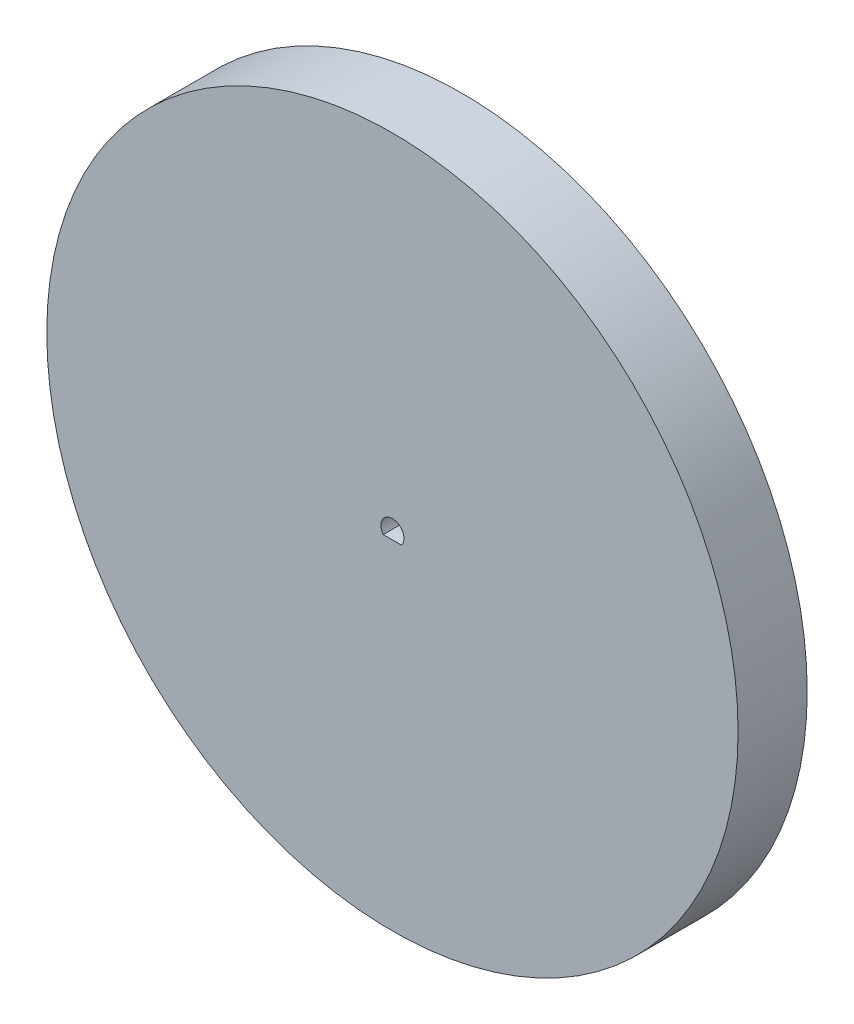
ISO-10303-21;
HEADER;
FILE_DESCRIPTION(('STEP AP214'),'2;1');
FILE_NAME('part.step','',(''),(''),'','','');
FILE_SCHEMA(('AUTOMOTIVE_DESIGN { 1 0 10303 214 1 1 1 1 }'));
ENDSEC;
DATA;
#1=APPLICATION_CONTEXT('core data for automotive mechanical design processes');
#2=APPLICATION_PROTOCOL_DEFINITION('international standard','automotive_design',2000,#1);
#3=PRODUCT_CONTEXT('',#1,'mechanical');
#4=PRODUCT('Part','Part','',(#3));
#5=PRODUCT_RELATED_PRODUCT_CATEGORY('part','',(#4));
#6=PRODUCT_DEFINITION_FORMATION('','',#4);
#7=PRODUCT_DEFINITION_CONTEXT('part definition',#1,'design');
#8=PRODUCT_DEFINITION('design','',#6,#7);
#9=PRODUCT_DEFINITION_SHAPE('','',#8);
#10=(LENGTH_UNIT() NAMED_UNIT(*) SI_UNIT(.MILLI.,.METRE.));
#11=(NAMED_UNIT(*) PLANE_ANGLE_UNIT() SI_UNIT($,.RADIAN.));
#12=(NAMED_UNIT(*) SI_UNIT($,.STERADIAN.) SOLID_ANGLE_UNIT());
#13=UNCERTAINTY_MEASURE_WITH_UNIT(LENGTH_MEASURE(1.E-05),#10,'distance_accuracy_value','');
#14=(GEOMETRIC_REPRESENTATION_CONTEXT(3) GLOBAL_UNCERTAINTY_ASSIGNED_CONTEXT((#13)) GLOBAL_UNIT_ASSIGNED_CONTEXT((#10,
#11,#12)) REPRESENTATION_CONTEXT('',''));
#15=CARTESIAN_POINT('',(0.,0.,0.));
#16=DIRECTION('',(0.,0.,1.));
#17=DIRECTION('',(1.,0.,0.));
#18=AXIS2_PLACEMENT_3D('',#15,#16,#17);
#19=CARTESIAN_POINT('',(0.,0.,15.));
#20=DIRECTION('',(0.,0.,-1.));
#21=DIRECTION('',(-1.,0.,0.));
#22=AXIS2_PLACEMENT_3D('',#19,#20,#21);
#23=CYLINDRICAL_SURFACE('',#22,2.5);
#24=CARTESIAN_POINT('',(0.,0.,0.));
#25=DIRECTION('',(0.,0.,1.));
#26=DIRECTION('',(1.,0.,0.));
#27=AXIS2_PLACEMENT_3D('',#24,#25,#26);
#28=CIRCLE('',#27,2.5);
#29=CARTESIAN_POINT('',(2.,-1.5,0.));
#30=VERTEX_POINT('',#29);
#31=CARTESIAN_POINT('',(-2.,-1.5,0.));
#32=VERTEX_POINT('',#31);
#33=EDGE_CURVE('E76',#30,#32,#28,.T.);
#34=ORIENTED_EDGE('',*,*,#33,.F.);
#35=DIRECTION('',(0.,0.,-1.));
#36=VECTOR('',#35,1.);
#37=CARTESIAN_POINT('',(2.,-1.5,15.));
#38=LINE('',#37,#36);
#39=CARTESIAN_POINT('',(2.,-1.5,15.));
#40=VERTEX_POINT('',#39);
#41=EDGE_CURVE('E13',#40,#30,#38,.T.);
#42=ORIENTED_EDGE('',*,*,#41,.F.);
#43=CARTESIAN_POINT('',(0.,0.,15.));
#44=DIRECTION('',(0.,0.,1.));
#45=DIRECTION('',(1.,0.,0.));
#46=AXIS2_PLACEMENT_3D('',#43,#44,#45);
#47=CIRCLE('',#46,2.5);
#48=CARTESIAN_POINT('',(-2.,-1.5,15.));
#49=VERTEX_POINT('',#48);
#50=EDGE_CURVE('E77',#40,#49,#47,.T.);
#51=ORIENTED_EDGE('',*,*,#50,.T.);
#52=DIRECTION('',(0.,0.,-1.));
#53=VECTOR('',#52,1.);
#54=CARTESIAN_POINT('',(-2.,-1.5,15.));
#55=LINE('',#54,#53);
#56=EDGE_CURVE('E56',#49,#32,#55,.T.);
#57=ORIENTED_EDGE('',*,*,#56,.T.);
#58=EDGE_LOOP('',(#34,#42,#51,#57));
#59=FACE_BOUND('',#58,.T.);
#60=ADVANCED_FACE('F48',(#59),#23,.F.);
#61=CARTESIAN_POINT('',(0.,-1.5,15.));
#62=DIRECTION('',(0.,-1.,0.));
#63=DIRECTION('',(0.,0.,-1.));
#64=AXIS2_PLACEMENT_3D('',#61,#62,#63);
#65=PLANE('',#64);
#66=DIRECTION('',(-1.,0.,0.));
#67=VECTOR('',#66,1.);
#68=CARTESIAN_POINT('',(0.,-1.5,0.));
#69=LINE('',#68,#67);
#70=EDGE_CURVE('E79',#30,#32,#69,.T.);
#71=ORIENTED_EDGE('',*,*,#70,.T.);
#72=ORIENTED_EDGE('',*,*,#56,.F.);
#73=DIRECTION('',(-1.,0.,0.));
#74=VECTOR('',#73,1.);
#75=CARTESIAN_POINT('',(0.,-1.5,15.));
#76=LINE('',#75,#74);
#77=EDGE_CURVE('E63',#40,#49,#76,.T.);
#78=ORIENTED_EDGE('',*,*,#77,.F.);
#79=ORIENTED_EDGE('',*,*,#41,.T.);
#80=EDGE_LOOP('',(#71,#72,#78,#79));
#81=FACE_BOUND('',#80,.T.);
#82=ADVANCED_FACE('F80',(#81),#65,.F.);
#83=CARTESIAN_POINT('',(0.,0.,15.));
#84=DIRECTION('',(0.,0.,-1.));
#85=DIRECTION('',(-1.,0.,0.));
#86=AXIS2_PLACEMENT_3D('',#83,#84,#85);
#87=CYLINDRICAL_SURFACE('',#86,75.);
#88=CARTESIAN_POINT('',(0.,0.,15.));
#89=DIRECTION('',(0.,0.,1.));
#90=DIRECTION('',(1.,0.,0.));
#91=AXIS2_PLACEMENT_3D('',#88,#89,#90);
#92=CIRCLE('',#91,75.);
#93=CARTESIAN_POINT('',(75.,0.,15.));
#94=VERTEX_POINT('',#93);
#95=EDGE_CURVE('E78',#94,#94,#92,.T.);
#96=ORIENTED_EDGE('',*,*,#95,.F.);
#97=EDGE_LOOP('',(#96));
#98=FACE_BOUND('',#97,.T.);
#99=CARTESIAN_POINT('',(0.,0.,0.));
#100=DIRECTION('',(0.,0.,1.));
#101=DIRECTION('',(1.,0.,0.));
#102=AXIS2_PLACEMENT_3D('',#99,#100,#101);
#103=CIRCLE('',#102,75.);
#104=CARTESIAN_POINT('',(75.,0.,0.));
#105=VERTEX_POINT('',#104);
#106=EDGE_CURVE('E82',#105,#105,#103,.T.);
#107=ORIENTED_EDGE('',*,*,#106,.T.);
#108=EDGE_LOOP('',(#107));
#109=FACE_BOUND('',#108,.T.);
#110=ADVANCED_FACE('F99',(#98,#109),#87,.T.);
#111=CARTESIAN_POINT('',(0.,0.,15.));
#112=DIRECTION('',(0.,0.,1.));
#113=DIRECTION('',(1.,0.,0.));
#114=AXIS2_PLACEMENT_3D('',#111,#112,#113);
#115=PLANE('',#114);
#116=ORIENTED_EDGE('',*,*,#50,.F.);
#117=ORIENTED_EDGE('',*,*,#77,.T.);
#118=EDGE_LOOP('',(#116,#117));
#119=FACE_BOUND('',#118,.T.);
#120=ORIENTED_EDGE('',*,*,#95,.T.);
#121=EDGE_LOOP('',(#120));
#122=FACE_BOUND('',#121,.T.);
#123=ADVANCED_FACE('F97',(#119,#122),#115,.T.);
#124=CARTESIAN_POINT('',(0.,0.,0.));
#125=DIRECTION('',(0.,0.,1.));
#126=DIRECTION('',(1.,0.,0.));
#127=AXIS2_PLACEMENT_3D('',#124,#125,#126);
#128=PLANE('',#127);
#129=ORIENTED_EDGE('',*,*,#33,.T.);
#130=ORIENTED_EDGE('',*,*,#70,.F.);
#131=EDGE_LOOP('',(#129,#130));
#132=FACE_BOUND('',#131,.T.);
#133=ORIENTED_EDGE('',*,*,#106,.F.);
#134=EDGE_LOOP('',(#133));
#135=FACE_BOUND('',#134,.T.);
#136=ADVANCED_FACE('F84',(#132,#135),#128,.F.);
#137=CLOSED_SHELL('',(#60,#82,#110,#123,#136));
#138=MANIFOLD_SOLID_BREP('B2',#137);
#139=ADVANCED_BREP_SHAPE_REPRESENTATION('',(#18,#138),#14);
#140=SHAPE_DEFINITION_REPRESENTATION(#9,#139);
ENDSEC;
END-ISO-10303-21;
